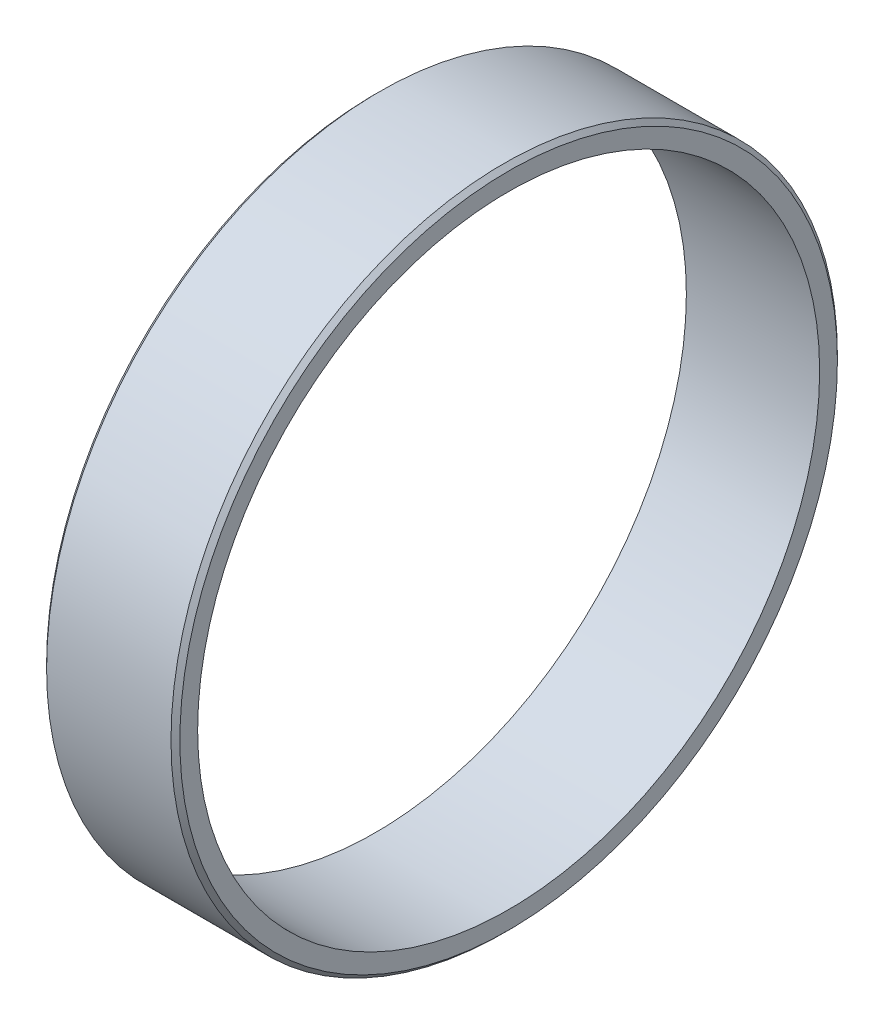
ISO-10303-21;
HEADER;
FILE_DESCRIPTION(('STEP AP214'),'2;1');
FILE_NAME('part.step','',(''),(''),'','','');
FILE_SCHEMA(('AUTOMOTIVE_DESIGN { 1 0 10303 214 1 1 1 1 }'));
ENDSEC;
DATA;
#1=APPLICATION_CONTEXT('core data for automotive mechanical design processes');
#2=APPLICATION_PROTOCOL_DEFINITION('international standard','automotive_design',2000,#1);
#3=PRODUCT_CONTEXT('',#1,'mechanical');
#4=PRODUCT('Part','Part','',(#3));
#5=PRODUCT_RELATED_PRODUCT_CATEGORY('part','',(#4));
#6=PRODUCT_DEFINITION_FORMATION('','',#4);
#7=PRODUCT_DEFINITION_CONTEXT('part definition',#1,'design');
#8=PRODUCT_DEFINITION('design','',#6,#7);
#9=PRODUCT_DEFINITION_SHAPE('','',#8);
#10=(LENGTH_UNIT() NAMED_UNIT(*) SI_UNIT(.MILLI.,.METRE.));
#11=(NAMED_UNIT(*) PLANE_ANGLE_UNIT() SI_UNIT($,.RADIAN.));
#12=(NAMED_UNIT(*) SI_UNIT($,.STERADIAN.) SOLID_ANGLE_UNIT());
#13=UNCERTAINTY_MEASURE_WITH_UNIT(LENGTH_MEASURE(1.E-05),#10,'distance_accuracy_value','');
#14=(GEOMETRIC_REPRESENTATION_CONTEXT(3) GLOBAL_UNCERTAINTY_ASSIGNED_CONTEXT((#13)) GLOBAL_UNIT_ASSIGNED_CONTEXT((#10,
#11,#12)) REPRESENTATION_CONTEXT('',''));
#15=CARTESIAN_POINT('',(0.,0.,0.));
#16=DIRECTION('',(0.,0.,1.));
#17=DIRECTION('',(1.,0.,0.));
#18=AXIS2_PLACEMENT_3D('',#15,#16,#17);
#19=CARTESIAN_POINT('',(7.50000000000003,-35.,0.));
#20=DIRECTION('',(1.,0.,0.));
#21=DIRECTION('',(0.,0.,-1.));
#22=AXIS2_PLACEMENT_3D('',#19,#20,#21);
#23=PLANE('',#22);
#24=CARTESIAN_POINT('',(7.50000000000003,0.,0.));
#25=DIRECTION('',(1.,0.,0.));
#26=DIRECTION('',(0.,0.,-1.));
#27=AXIS2_PLACEMENT_3D('',#24,#25,#26);
#28=CIRCLE('',#27,37.);
#29=CARTESIAN_POINT('',(7.50000000000003,0.,-37.));
#30=VERTEX_POINT('',#29);
#31=EDGE_CURVE('E10',#30,#30,#28,.T.);
#32=ORIENTED_EDGE('',*,*,#31,.T.);
#33=EDGE_LOOP('',(#32));
#34=FACE_BOUND('',#33,.T.);
#35=CARTESIAN_POINT('',(7.50000000000003,0.,0.));
#36=DIRECTION('',(-1.,0.,0.));
#37=DIRECTION('',(0.,0.,1.));
#38=AXIS2_PLACEMENT_3D('',#35,#36,#37);
#39=CIRCLE('',#38,35.);
#40=CARTESIAN_POINT('',(7.50000000000003,0.,35.));
#41=VERTEX_POINT('',#40);
#42=EDGE_CURVE('E70',#41,#41,#39,.T.);
#43=ORIENTED_EDGE('',*,*,#42,.T.);
#44=EDGE_LOOP('',(#43));
#45=FACE_BOUND('',#44,.T.);
#46=ADVANCED_FACE('F45',(#34,#45),#23,.T.);
#47=CARTESIAN_POINT('',(-29.3924948979592,0.,0.));
#48=DIRECTION('',(-1.,0.,0.));
#49=DIRECTION('',(0.,0.,1.));
#50=AXIS2_PLACEMENT_3D('',#47,#48,#49);
#51=CYLINDRICAL_SURFACE('',#50,35.);
#52=CARTESIAN_POINT('',(-7.49999999999997,0.,0.));
#53=DIRECTION('',(-1.,0.,0.));
#54=DIRECTION('',(0.,0.,1.));
#55=AXIS2_PLACEMENT_3D('',#52,#53,#54);
#56=CIRCLE('',#55,35.);
#57=CARTESIAN_POINT('',(-7.49999999999997,0.,35.));
#58=VERTEX_POINT('',#57);
#59=EDGE_CURVE('E74',#58,#58,#56,.T.);
#60=ORIENTED_EDGE('',*,*,#59,.T.);
#61=EDGE_LOOP('',(#60));
#62=FACE_BOUND('',#61,.T.);
#63=ORIENTED_EDGE('',*,*,#42,.F.);
#64=EDGE_LOOP('',(#63));
#65=FACE_BOUND('',#64,.T.);
#66=ADVANCED_FACE('F79',(#62,#65),#51,.F.);
#67=CARTESIAN_POINT('',(-7.49999999999997,-35.,0.));
#68=DIRECTION('',(-1.,0.,0.));
#69=DIRECTION('',(0.,0.,1.));
#70=AXIS2_PLACEMENT_3D('',#67,#68,#69);
#71=PLANE('',#70);
#72=CARTESIAN_POINT('',(-7.49999999999997,0.,0.));
#73=DIRECTION('',(-1.,0.,0.));
#74=DIRECTION('',(0.,0.,1.));
#75=AXIS2_PLACEMENT_3D('',#72,#73,#74);
#76=CIRCLE('',#75,37.);
#77=CARTESIAN_POINT('',(-7.49999999999997,0.,37.));
#78=VERTEX_POINT('',#77);
#79=EDGE_CURVE('E64',#78,#78,#76,.T.);
#80=ORIENTED_EDGE('',*,*,#79,.T.);
#81=EDGE_LOOP('',(#80));
#82=FACE_BOUND('',#81,.T.);
#83=ORIENTED_EDGE('',*,*,#59,.F.);
#84=EDGE_LOOP('',(#83));
#85=FACE_BOUND('',#84,.T.);
#86=ADVANCED_FACE('F82',(#82,#85),#71,.T.);
#87=CARTESIAN_POINT('',(-29.3924948979592,0.,0.));
#88=DIRECTION('',(-1.,0.,0.));
#89=DIRECTION('',(0.,0.,1.));
#90=AXIS2_PLACEMENT_3D('',#87,#88,#89);
#91=CYLINDRICAL_SURFACE('',#90,37.5);
#92=CARTESIAN_POINT('',(-6.99999999999998,0.,0.));
#93=DIRECTION('',(-1.,0.,0.));
#94=DIRECTION('',(0.,0.,1.));
#95=AXIS2_PLACEMENT_3D('',#92,#93,#94);
#96=CIRCLE('',#95,37.5);
#97=CARTESIAN_POINT('',(-6.99999999999998,0.,37.5));
#98=VERTEX_POINT('',#97);
#99=EDGE_CURVE('E54',#98,#98,#96,.F.);
#100=ORIENTED_EDGE('',*,*,#99,.T.);
#101=EDGE_LOOP('',(#100));
#102=FACE_BOUND('',#101,.T.);
#103=CARTESIAN_POINT('',(7.00000000000003,0.,0.));
#104=DIRECTION('',(1.,0.,0.));
#105=DIRECTION('',(0.,0.,-1.));
#106=AXIS2_PLACEMENT_3D('',#103,#104,#105);
#107=CIRCLE('',#106,37.5);
#108=CARTESIAN_POINT('',(7.00000000000003,0.,-37.5));
#109=VERTEX_POINT('',#108);
#110=EDGE_CURVE('E59',#109,#109,#107,.F.);
#111=ORIENTED_EDGE('',*,*,#110,.T.);
#112=EDGE_LOOP('',(#111));
#113=FACE_BOUND('',#112,.T.);
#114=ADVANCED_FACE('F84',(#102,#113),#91,.T.);
#115=CARTESIAN_POINT('',(-7.49999999999997,0.,0.));
#116=DIRECTION('',(1.,0.,0.));
#117=DIRECTION('',(0.,0.,-1.));
#118=AXIS2_PLACEMENT_3D('',#115,#116,#117);
#119=CONICAL_SURFACE('',#118,37.,0.785398163397441);
#120=ORIENTED_EDGE('',*,*,#99,.F.);
#121=EDGE_LOOP('',(#120));
#122=FACE_BOUND('',#121,.T.);
#123=ORIENTED_EDGE('',*,*,#79,.F.);
#124=EDGE_LOOP('',(#123));
#125=FACE_BOUND('',#124,.T.);
#126=ADVANCED_FACE('F91',(#122,#125),#119,.T.);
#127=CARTESIAN_POINT('',(7.00000000000003,0.,0.));
#128=DIRECTION('',(-1.,0.,0.));
#129=DIRECTION('',(0.,0.,1.));
#130=AXIS2_PLACEMENT_3D('',#127,#128,#129);
#131=CONICAL_SURFACE('',#130,37.5,0.785398163397448);
#132=ORIENTED_EDGE('',*,*,#31,.F.);
#133=EDGE_LOOP('',(#132));
#134=FACE_BOUND('',#133,.T.);
#135=ORIENTED_EDGE('',*,*,#110,.F.);
#136=EDGE_LOOP('',(#135));
#137=FACE_BOUND('',#136,.T.);
#138=ADVANCED_FACE('F48',(#134,#137),#131,.T.);
#139=CLOSED_SHELL('',(#46,#66,#86,#114,#126,#138));
#140=MANIFOLD_SOLID_BREP('B2',#139);
#141=ADVANCED_BREP_SHAPE_REPRESENTATION('',(#18,#140),#14);
#142=SHAPE_DEFINITION_REPRESENTATION(#9,#141);
ENDSEC;
END-ISO-10303-21;
